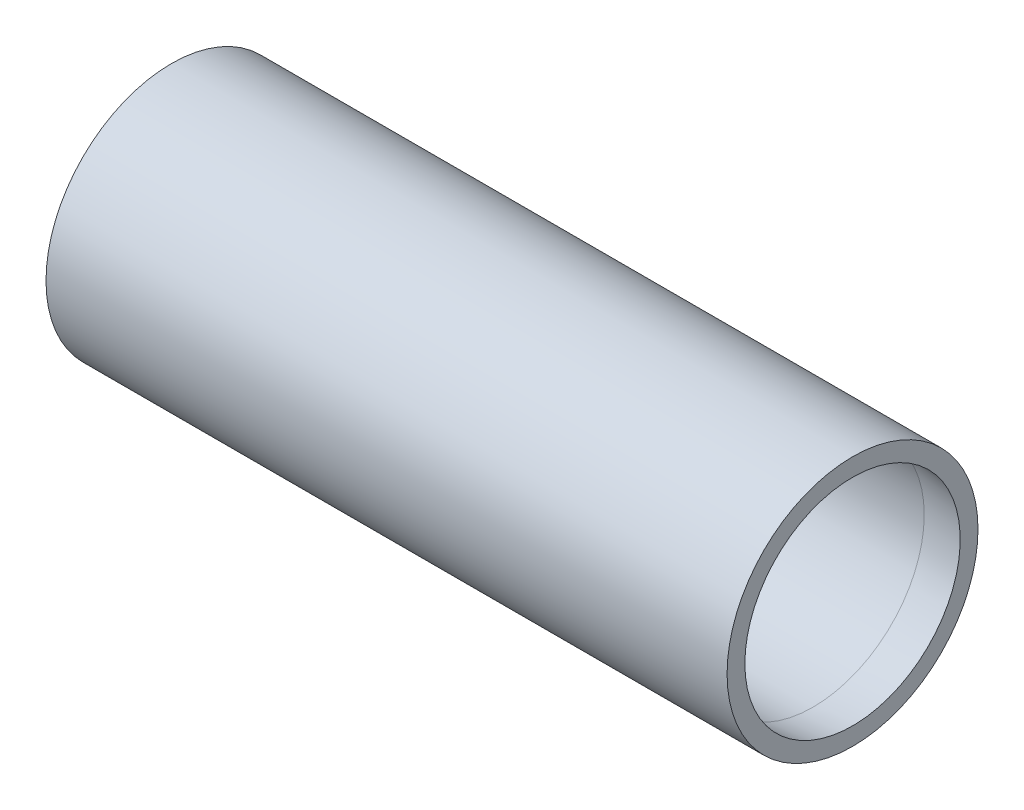
ISO-10303-21;
HEADER;
FILE_DESCRIPTION(('STEP AP214'),'2;1');
FILE_NAME('part.step','',(''),(''),'','','');
FILE_SCHEMA(('AUTOMOTIVE_DESIGN { 1 0 10303 214 1 1 1 1 }'));
ENDSEC;
DATA;
#1=APPLICATION_CONTEXT('core data for automotive mechanical design processes');
#2=APPLICATION_PROTOCOL_DEFINITION('international standard','automotive_design',2000,#1);
#3=PRODUCT_CONTEXT('',#1,'mechanical');
#4=PRODUCT('Part','Part','',(#3));
#5=PRODUCT_RELATED_PRODUCT_CATEGORY('part','',(#4));
#6=PRODUCT_DEFINITION_FORMATION('','',#4);
#7=PRODUCT_DEFINITION_CONTEXT('part definition',#1,'design');
#8=PRODUCT_DEFINITION('design','',#6,#7);
#9=PRODUCT_DEFINITION_SHAPE('','',#8);
#10=(LENGTH_UNIT() NAMED_UNIT(*) SI_UNIT(.MILLI.,.METRE.));
#11=(NAMED_UNIT(*) PLANE_ANGLE_UNIT() SI_UNIT($,.RADIAN.));
#12=(NAMED_UNIT(*) SI_UNIT($,.STERADIAN.) SOLID_ANGLE_UNIT());
#13=UNCERTAINTY_MEASURE_WITH_UNIT(LENGTH_MEASURE(1.E-05),#10,'distance_accuracy_value','');
#14=(GEOMETRIC_REPRESENTATION_CONTEXT(3) GLOBAL_UNCERTAINTY_ASSIGNED_CONTEXT((#13)) GLOBAL_UNIT_ASSIGNED_CONTEXT((#10,
#11,#12)) REPRESENTATION_CONTEXT('',''));
#15=CARTESIAN_POINT('',(0.,0.,0.));
#16=DIRECTION('',(0.,0.,1.));
#17=DIRECTION('',(1.,0.,0.));
#18=AXIS2_PLACEMENT_3D('',#15,#16,#17);
#19=CARTESIAN_POINT('',(0.,17.5,0.));
#20=DIRECTION('',(1.,0.,0.));
#21=DIRECTION('',(0.,0.,-1.));
#22=AXIS2_PLACEMENT_3D('',#19,#20,#21);
#23=PLANE('',#22);
#24=CARTESIAN_POINT('',(0.,0.,0.));
#25=DIRECTION('',(-1.,0.,0.));
#26=DIRECTION('',(0.,0.,1.));
#27=AXIS2_PLACEMENT_3D('',#24,#25,#26);
#28=CIRCLE('',#27,15.5);
#29=CARTESIAN_POINT('',(0.,0.,15.5));
#30=VERTEX_POINT('',#29);
#31=EDGE_CURVE('E10',#30,#30,#28,.T.);
#32=ORIENTED_EDGE('',*,*,#31,.F.);
#33=EDGE_LOOP('',(#32));
#34=FACE_BOUND('',#33,.T.);
#35=CARTESIAN_POINT('',(0.,0.,0.));
#36=DIRECTION('',(-1.,0.,0.));
#37=DIRECTION('',(0.,0.,1.));
#38=AXIS2_PLACEMENT_3D('',#35,#36,#37);
#39=CIRCLE('',#38,17.5);
#40=CARTESIAN_POINT('',(0.,0.,17.5));
#41=VERTEX_POINT('',#40);
#42=EDGE_CURVE('E58',#41,#41,#39,.T.);
#43=ORIENTED_EDGE('',*,*,#42,.T.);
#44=EDGE_LOOP('',(#43));
#45=FACE_BOUND('',#44,.T.);
#46=ADVANCED_FACE('F39',(#34,#45),#23,.F.);
#47=CARTESIAN_POINT('',(0.,0.,0.));
#48=DIRECTION('',(-1.,0.,0.));
#49=DIRECTION('',(0.,0.,1.));
#50=AXIS2_PLACEMENT_3D('',#47,#48,#49);
#51=CYLINDRICAL_SURFACE('',#50,15.5);
#52=CARTESIAN_POINT('',(89.5,0.,0.));
#53=DIRECTION('',(-1.,0.,0.));
#54=DIRECTION('',(0.,0.,1.));
#55=AXIS2_PLACEMENT_3D('',#52,#53,#54);
#56=CIRCLE('',#55,15.5);
#57=CARTESIAN_POINT('',(89.5,0.,15.5));
#58=VERTEX_POINT('',#57);
#59=EDGE_CURVE('E45',#58,#58,#56,.T.);
#60=ORIENTED_EDGE('',*,*,#59,.F.);
#61=EDGE_LOOP('',(#60));
#62=FACE_BOUND('',#61,.T.);
#63=ORIENTED_EDGE('',*,*,#31,.T.);
#64=EDGE_LOOP('',(#63));
#65=FACE_BOUND('',#64,.T.);
#66=ADVANCED_FACE('F77',(#62,#65),#51,.F.);
#67=CARTESIAN_POINT('',(89.5,0.,0.));
#68=DIRECTION('',(-1.,0.,0.));
#69=DIRECTION('',(0.,0.,1.));
#70=AXIS2_PLACEMENT_3D('',#67,#68,#69);
#71=CONICAL_SURFACE('',#70,15.5,0.0872664625997168);
#72=CARTESIAN_POINT('',(95.,0.,0.));
#73=DIRECTION('',(-1.,0.,0.));
#74=DIRECTION('',(0.,0.,1.));
#75=AXIS2_PLACEMENT_3D('',#72,#73,#74);
#76=CIRCLE('',#75,15.0188123506074);
#77=CARTESIAN_POINT('',(95.,0.,15.0188123506074));
#78=VERTEX_POINT('',#77);
#79=EDGE_CURVE('E49',#78,#78,#76,.T.);
#80=ORIENTED_EDGE('',*,*,#79,.F.);
#81=EDGE_LOOP('',(#80));
#82=FACE_BOUND('',#81,.T.);
#83=ORIENTED_EDGE('',*,*,#59,.T.);
#84=EDGE_LOOP('',(#83));
#85=FACE_BOUND('',#84,.T.);
#86=ADVANCED_FACE('F72',(#82,#85),#71,.F.);
#87=CARTESIAN_POINT('',(95.,15.0188123506074,0.));
#88=DIRECTION('',(-1.,0.,0.));
#89=DIRECTION('',(0.,0.,1.));
#90=AXIS2_PLACEMENT_3D('',#87,#88,#89);
#91=PLANE('',#90);
#92=CARTESIAN_POINT('',(95.,0.,0.));
#93=DIRECTION('',(-1.,0.,0.));
#94=DIRECTION('',(0.,0.,1.));
#95=AXIS2_PLACEMENT_3D('',#92,#93,#94);
#96=CIRCLE('',#95,17.5);
#97=CARTESIAN_POINT('',(95.,0.,17.5));
#98=VERTEX_POINT('',#97);
#99=EDGE_CURVE('E53',#98,#98,#96,.T.);
#100=ORIENTED_EDGE('',*,*,#99,.F.);
#101=EDGE_LOOP('',(#100));
#102=FACE_BOUND('',#101,.T.);
#103=ORIENTED_EDGE('',*,*,#79,.T.);
#104=EDGE_LOOP('',(#103));
#105=FACE_BOUND('',#104,.T.);
#106=ADVANCED_FACE('F66',(#102,#105),#91,.F.);
#107=CARTESIAN_POINT('',(0.,0.,0.));
#108=DIRECTION('',(-1.,0.,0.));
#109=DIRECTION('',(0.,0.,1.));
#110=AXIS2_PLACEMENT_3D('',#107,#108,#109);
#111=CYLINDRICAL_SURFACE('',#110,17.5);
#112=ORIENTED_EDGE('',*,*,#42,.F.);
#113=EDGE_LOOP('',(#112));
#114=FACE_BOUND('',#113,.T.);
#115=ORIENTED_EDGE('',*,*,#99,.T.);
#116=EDGE_LOOP('',(#115));
#117=FACE_BOUND('',#116,.T.);
#118=ADVANCED_FACE('F63',(#114,#117),#111,.T.);
#119=CLOSED_SHELL('',(#46,#66,#86,#106,#118));
#120=MANIFOLD_SOLID_BREP('B2',#119);
#121=ADVANCED_BREP_SHAPE_REPRESENTATION('',(#18,#120),#14);
#122=SHAPE_DEFINITION_REPRESENTATION(#9,#121);
ENDSEC;
END-ISO-10303-21;
